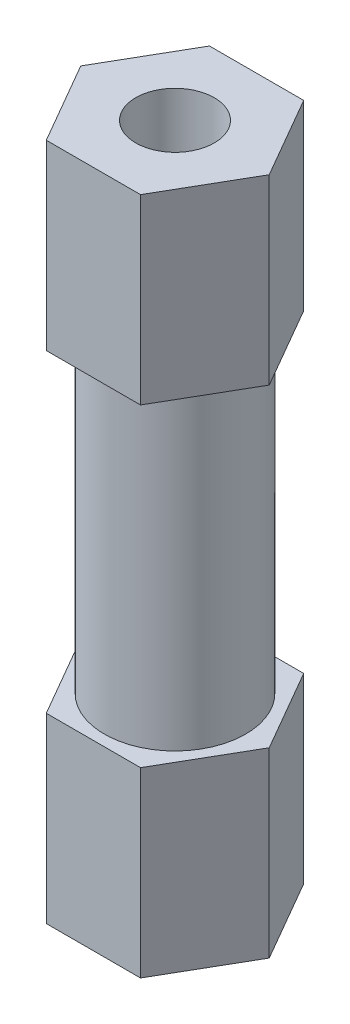
ISO-10303-21;
HEADER;
FILE_DESCRIPTION(('STEP AP214'),'2;1');
FILE_NAME('part.step','',(''),(''),'','','');
FILE_SCHEMA(('AUTOMOTIVE_DESIGN { 1 0 10303 214 1 1 1 1 }'));
ENDSEC;
DATA;
#1=APPLICATION_CONTEXT('core data for automotive mechanical design processes');
#2=APPLICATION_PROTOCOL_DEFINITION('international standard','automotive_design',2000,#1);
#3=PRODUCT_CONTEXT('',#1,'mechanical');
#4=PRODUCT('Part','Part','',(#3));
#5=PRODUCT_RELATED_PRODUCT_CATEGORY('part','',(#4));
#6=PRODUCT_DEFINITION_FORMATION('','',#4);
#7=PRODUCT_DEFINITION_CONTEXT('part definition',#1,'design');
#8=PRODUCT_DEFINITION('design','',#6,#7);
#9=PRODUCT_DEFINITION_SHAPE('','',#8);
#10=(LENGTH_UNIT() NAMED_UNIT(*) SI_UNIT(.MILLI.,.METRE.));
#11=(NAMED_UNIT(*) PLANE_ANGLE_UNIT() SI_UNIT($,.RADIAN.));
#12=(NAMED_UNIT(*) SI_UNIT($,.STERADIAN.) SOLID_ANGLE_UNIT());
#13=UNCERTAINTY_MEASURE_WITH_UNIT(LENGTH_MEASURE(1.E-05),#10,'distance_accuracy_value','');
#14=(GEOMETRIC_REPRESENTATION_CONTEXT(3) GLOBAL_UNCERTAINTY_ASSIGNED_CONTEXT((#13)) GLOBAL_UNIT_ASSIGNED_CONTEXT((#10,
#11,#12)) REPRESENTATION_CONTEXT('',''));
#15=CARTESIAN_POINT('',(0.,0.,0.));
#16=DIRECTION('',(0.,0.,1.));
#17=DIRECTION('',(1.,0.,0.));
#18=AXIS2_PLACEMENT_3D('',#15,#16,#17);
#19=CARTESIAN_POINT('',(0.,14.2,0.));
#20=DIRECTION('',(0.,-1.,0.));
#21=DIRECTION('',(0.,0.,-1.));
#22=AXIS2_PLACEMENT_3D('',#19,#20,#21);
#23=CYLINDRICAL_SURFACE('',#22,2.25);
#24=CARTESIAN_POINT('',(0.,4.2,0.));
#25=DIRECTION('',(0.,-1.,0.));
#26=DIRECTION('',(0.,0.,-1.));
#27=AXIS2_PLACEMENT_3D('',#24,#25,#26);
#28=CIRCLE('',#27,2.25);
#29=CARTESIAN_POINT('',(0.,4.2,-2.25));
#30=VERTEX_POINT('',#29);
#31=EDGE_CURVE('E126',#30,#30,#28,.F.);
#32=ORIENTED_EDGE('',*,*,#31,.T.);
#33=EDGE_LOOP('',(#32));
#34=FACE_BOUND('',#33,.T.);
#35=CARTESIAN_POINT('',(0.,14.2,0.));
#36=DIRECTION('',(0.,-1.,0.));
#37=DIRECTION('',(0.,0.,-1.));
#38=AXIS2_PLACEMENT_3D('',#35,#36,#37);
#39=CIRCLE('',#38,2.25);
#40=CARTESIAN_POINT('',(0.,14.2,-2.25));
#41=VERTEX_POINT('',#40);
#42=EDGE_CURVE('E20',#41,#41,#39,.F.);
#43=ORIENTED_EDGE('',*,*,#42,.F.);
#44=EDGE_LOOP('',(#43));
#45=FACE_BOUND('',#44,.T.);
#46=ADVANCED_FACE('F17',(#34,#45),#23,.T.);
#47=CARTESIAN_POINT('',(0.,14.2,0.));
#48=DIRECTION('',(0.,-1.,0.));
#49=DIRECTION('',(0.,0.,-1.));
#50=AXIS2_PLACEMENT_3D('',#47,#48,#49);
#51=PLANE('',#50);
#52=ORIENTED_EDGE('',*,*,#42,.T.);
#53=EDGE_LOOP('',(#52));
#54=FACE_BOUND('',#53,.T.);
#55=DIRECTION('',(0.500000000050997,0.,-0.866025403754996));
#56=VECTOR('',#55,1.);
#57=CARTESIAN_POINT('',(1.5,14.2,2.598076211));
#58=LINE('',#57,#56);
#59=CARTESIAN_POINT('',(1.49999999994262,14.2,2.59807621107729));
#60=VERTEX_POINT('',#59);
#61=CARTESIAN_POINT('',(2.99999999998088,14.2,-3.31225974548503E-11));
#62=VERTEX_POINT('',#61);
#63=EDGE_CURVE('E117',#60,#62,#58,.T.);
#64=ORIENTED_EDGE('',*,*,#63,.F.);
#65=DIRECTION('',(1.,0.,0.));
#66=VECTOR('',#65,1.);
#67=CARTESIAN_POINT('',(-1.5,14.2,2.598076211));
#68=LINE('',#67,#66);
#69=CARTESIAN_POINT('',(-1.4999999999235,14.2,2.59807621106625));
#70=VERTEX_POINT('',#69);
#71=EDGE_CURVE('E108',#70,#60,#68,.T.);
#72=ORIENTED_EDGE('',*,*,#71,.F.);
#73=DIRECTION('',(0.500000000050997,0.,0.866025403754996));
#74=VECTOR('',#73,1.);
#75=CARTESIAN_POINT('',(-3.,14.2,0.));
#76=LINE('',#75,#74);
#77=CARTESIAN_POINT('',(-2.99999999998088,14.2,3.31232520129126E-11));
#78=VERTEX_POINT('',#77);
#79=EDGE_CURVE('E103',#78,#70,#76,.T.);
#80=ORIENTED_EDGE('',*,*,#79,.F.);
#81=DIRECTION('',(-0.500000000050997,0.,0.866025403754996));
#82=VECTOR('',#81,1.);
#83=CARTESIAN_POINT('',(-1.5,14.2,-2.598076211));
#84=LINE('',#83,#82);
#85=CARTESIAN_POINT('',(-1.49999999986613,14.2,-2.59807621107729));
#86=VERTEX_POINT('',#85);
#87=EDGE_CURVE('E263',#86,#78,#84,.T.);
#88=ORIENTED_EDGE('',*,*,#87,.F.);
#89=DIRECTION('',(-1.,0.,0.));
#90=VECTOR('',#89,1.);
#91=CARTESIAN_POINT('',(1.5,14.2,-2.598076211));
#92=LINE('',#91,#90);
#93=CARTESIAN_POINT('',(1.49999999998005,14.2,-2.59807621103574));
#94=VERTEX_POINT('',#93);
#95=EDGE_CURVE('E259',#94,#86,#92,.T.);
#96=ORIENTED_EDGE('',*,*,#95,.F.);
#97=DIRECTION('',(-0.500000000050997,0.,-0.866025403754996));
#98=VECTOR('',#97,1.);
#99=CARTESIAN_POINT('',(3.,14.2,0.));
#100=LINE('',#99,#98);
#101=EDGE_CURVE('E122',#62,#94,#100,.T.);
#102=ORIENTED_EDGE('',*,*,#101,.F.);
#103=EDGE_LOOP('',(#64,#72,#80,#88,#96,#102));
#104=FACE_BOUND('',#103,.T.);
#105=ADVANCED_FACE('F120',(#54,#104),#51,.T.);
#106=CARTESIAN_POINT('',(0.,4.2,0.));
#107=DIRECTION('',(0.,-1.,0.));
#108=DIRECTION('',(0.,0.,-1.));
#109=AXIS2_PLACEMENT_3D('',#106,#107,#108);
#110=PLANE('',#109);
#111=ORIENTED_EDGE('',*,*,#31,.F.);
#112=EDGE_LOOP('',(#111));
#113=FACE_BOUND('',#112,.T.);
#114=DIRECTION('',(0.500000000050997,0.,-0.866025403754996));
#115=VECTOR('',#114,1.);
#116=CARTESIAN_POINT('',(1.5,4.19999999999999,2.598076211));
#117=LINE('',#116,#115);
#118=CARTESIAN_POINT('',(3.,4.19999999999999,0.));
#119=VERTEX_POINT('',#118);
#120=CARTESIAN_POINT('',(1.49999999996175,4.2,2.59807621106625));
#121=VERTEX_POINT('',#120);
#122=EDGE_CURVE('E219',#119,#121,#117,.F.);
#123=ORIENTED_EDGE('',*,*,#122,.F.);
#124=DIRECTION('',(-0.500000000050997,0.,-0.866025403754996));
#125=VECTOR('',#124,1.);
#126=CARTESIAN_POINT('',(3.,4.19999999999999,0.));
#127=LINE('',#126,#125);
#128=CARTESIAN_POINT('',(1.50000000014511,4.2,-2.59807621099157));
#129=VERTEX_POINT('',#128);
#130=EDGE_CURVE('E221',#129,#119,#127,.F.);
#131=ORIENTED_EDGE('',*,*,#130,.F.);
#132=DIRECTION('',(-1.,0.,0.));
#133=VECTOR('',#132,1.);
#134=CARTESIAN_POINT('',(1.5,4.2,-2.598076211));
#135=LINE('',#134,#133);
#136=CARTESIAN_POINT('',(-1.4999999998757,4.2,-2.59807621101656));
#137=VERTEX_POINT('',#136);
#138=EDGE_CURVE('E239',#137,#129,#135,.F.);
#139=ORIENTED_EDGE('',*,*,#138,.F.);
#140=DIRECTION('',(-0.500000000050997,0.,0.866025403754996));
#141=VECTOR('',#140,1.);
#142=CARTESIAN_POINT('',(-1.5,4.19999999999999,-2.598076211));
#143=LINE('',#142,#141);
#144=CARTESIAN_POINT('',(-2.99999999999044,4.19999999999999,-1.6560887317506E-11));
#145=VERTEX_POINT('',#144);
#146=EDGE_CURVE('E244',#145,#137,#143,.F.);
#147=ORIENTED_EDGE('',*,*,#146,.F.);
#148=DIRECTION('',(0.500000000050997,0.,0.866025403754996));
#149=VECTOR('',#148,1.);
#150=CARTESIAN_POINT('',(-3.,4.19999999999999,0.));
#151=LINE('',#150,#149);
#152=CARTESIAN_POINT('',(-1.49999999995219,4.2,2.59807621106073));
#153=VERTEX_POINT('',#152);
#154=EDGE_CURVE('E249',#153,#145,#151,.F.);
#155=ORIENTED_EDGE('',*,*,#154,.F.);
#156=DIRECTION('',(1.,0.,0.));
#157=VECTOR('',#156,1.);
#158=CARTESIAN_POINT('',(-1.5,4.2,2.598076211));
#159=LINE('',#158,#157);
#160=EDGE_CURVE('E223',#121,#153,#159,.F.);
#161=ORIENTED_EDGE('',*,*,#160,.F.);
#162=EDGE_LOOP('',(#123,#131,#139,#147,#155,#161));
#163=FACE_BOUND('',#162,.T.);
#164=ADVANCED_FACE('F149',(#113,#163),#110,.F.);
#165=CARTESIAN_POINT('',(1.5,10.110836135,2.598076211));
#166=DIRECTION('',(0.866025403754996,0.,0.500000000050997));
#167=DIRECTION('',(0.500000000050997,0.,-0.866025403754996));
#168=AXIS2_PLACEMENT_3D('',#165,#166,#167);
#169=PLANE('',#168);
#170=DIRECTION('',(0.,1.,0.));
#171=VECTOR('',#170,1.);
#172=CARTESIAN_POINT('',(2.99999999992351,10.110836135,-1.32489967643764E-10));
#173=LINE('',#172,#171);
#174=CARTESIAN_POINT('',(2.99999999990438,20.,-3.31230515849597E-11));
#175=VERTEX_POINT('',#174);
#176=EDGE_CURVE('E255',#175,#62,#173,.F.);
#177=ORIENTED_EDGE('',*,*,#176,.F.);
#178=DIRECTION('',(-0.5,0.,0.866025403784439));
#179=VECTOR('',#178,1.);
#180=CARTESIAN_POINT('',(2.99999999969403,20.,0.));
#181=LINE('',#180,#179);
#182=CARTESIAN_POINT('',(1.49999999991075,20.,2.59807621108833));
#183=VERTEX_POINT('',#182);
#184=EDGE_CURVE('E130',#175,#183,#181,.T.);
#185=ORIENTED_EDGE('',*,*,#184,.T.);
#186=DIRECTION('',(0.,1.,0.));
#187=VECTOR('',#186,1.);
#188=CARTESIAN_POINT('',(1.499999999949,10.110836135,2.598076211));
#189=LINE('',#188,#187);
#190=EDGE_CURVE('E113',#60,#183,#189,.T.);
#191=ORIENTED_EDGE('',*,*,#190,.F.);
#192=ORIENTED_EDGE('',*,*,#63,.T.);
#193=EDGE_LOOP('',(#177,#185,#191,#192));
#194=FACE_BOUND('',#193,.T.);
#195=ADVANCED_FACE('F129',(#194),#169,.T.);
#196=CARTESIAN_POINT('',(-1.5,10.110836135,2.598076211));
#197=DIRECTION('',(0.,0.,1.));
#198=DIRECTION('',(1.,0.,0.));
#199=AXIS2_PLACEMENT_3D('',#196,#197,#198);
#200=PLANE('',#199);
#201=ORIENTED_EDGE('',*,*,#190,.T.);
#202=DIRECTION('',(1.,0.,0.));
#203=VECTOR('',#202,1.);
#204=CARTESIAN_POINT('',(0.,20.,2.59807621108834));
#205=LINE('',#204,#203);
#206=CARTESIAN_POINT('',(-1.49999999987251,20.,2.59807621104417));
#207=VERTEX_POINT('',#206);
#208=EDGE_CURVE('E270',#183,#207,#205,.F.);
#209=ORIENTED_EDGE('',*,*,#208,.T.);
#210=DIRECTION('',(0.,1.,0.));
#211=VECTOR('',#210,1.);
#212=CARTESIAN_POINT('',(-1.499999999949,10.110836135,2.59807621108834));
#213=LINE('',#212,#211);
#214=EDGE_CURVE('E115',#70,#207,#213,.T.);
#215=ORIENTED_EDGE('',*,*,#214,.F.);
#216=ORIENTED_EDGE('',*,*,#71,.T.);
#217=EDGE_LOOP('',(#201,#209,#215,#216));
#218=FACE_BOUND('',#217,.T.);
#219=ADVANCED_FACE('F110',(#218),#200,.T.);
#220=CARTESIAN_POINT('',(-3.,10.110836135,0.));
#221=DIRECTION('',(-0.866025403754996,0.,0.500000000050997));
#222=DIRECTION('',(0.500000000050997,0.,0.866025403754996));
#223=AXIS2_PLACEMENT_3D('',#220,#221,#222);
#224=PLANE('',#223);
#225=ORIENTED_EDGE('',*,*,#214,.T.);
#226=DIRECTION('',(-0.5,0.,-0.866025403784439));
#227=VECTOR('',#226,1.);
#228=CARTESIAN_POINT('',(-1.49999999984701,20.,2.59807621108834));
#229=LINE('',#228,#227);
#230=CARTESIAN_POINT('',(-2.99999999988526,20.,6.62455814809509E-11));
#231=VERTEX_POINT('',#230);
#232=EDGE_CURVE('E266',#207,#231,#229,.T.);
#233=ORIENTED_EDGE('',*,*,#232,.T.);
#234=DIRECTION('',(0.,1.,0.));
#235=VECTOR('',#234,1.);
#236=CARTESIAN_POINT('',(-3.,10.110836135,0.));
#237=LINE('',#236,#235);
#238=EDGE_CURVE('E261',#78,#231,#237,.T.);
#239=ORIENTED_EDGE('',*,*,#238,.F.);
#240=ORIENTED_EDGE('',*,*,#79,.T.);
#241=EDGE_LOOP('',(#225,#233,#239,#240));
#242=FACE_BOUND('',#241,.T.);
#243=ADVANCED_FACE('F203',(#242),#224,.T.);
#244=CARTESIAN_POINT('',(-1.5,10.110836135,-2.598076211));
#245=DIRECTION('',(-0.866025403754996,0.,-0.500000000050997));
#246=DIRECTION('',(-0.500000000050997,0.,0.866025403754996));
#247=AXIS2_PLACEMENT_3D('',#244,#245,#246);
#248=PLANE('',#247);
#249=ORIENTED_EDGE('',*,*,#238,.T.);
#250=DIRECTION('',(0.5,0.,-0.866025403784439));
#251=VECTOR('',#250,1.);
#252=CARTESIAN_POINT('',(-2.99999999969403,20.,0.));
#253=LINE('',#252,#251);
#254=CARTESIAN_POINT('',(-1.49999999988526,20.,-2.59807621108833));
#255=VERTEX_POINT('',#254);
#256=EDGE_CURVE('E272',#231,#255,#253,.T.);
#257=ORIENTED_EDGE('',*,*,#256,.T.);
#258=DIRECTION('',(0.,1.,0.));
#259=VECTOR('',#258,1.);
#260=CARTESIAN_POINT('',(-1.49999999984701,10.110836135,-2.598076211));
#261=LINE('',#260,#259);
#262=EDGE_CURVE('E257',#86,#255,#261,.T.);
#263=ORIENTED_EDGE('',*,*,#262,.F.);
#264=ORIENTED_EDGE('',*,*,#87,.T.);
#265=EDGE_LOOP('',(#249,#257,#263,#264));
#266=FACE_BOUND('',#265,.T.);
#267=ADVANCED_FACE('F199',(#266),#248,.T.);
#268=CARTESIAN_POINT('',(1.5,10.110836135,-2.598076211));
#269=DIRECTION('',(0.,0.,-1.));
#270=DIRECTION('',(-1.,0.,0.));
#271=AXIS2_PLACEMENT_3D('',#268,#269,#270);
#272=PLANE('',#271);
#273=ORIENTED_EDGE('',*,*,#262,.T.);
#274=DIRECTION('',(1.,0.,0.));
#275=VECTOR('',#274,1.);
#276=CARTESIAN_POINT('',(0.,20.,-2.59807621108834));
#277=LINE('',#276,#275);
#278=CARTESIAN_POINT('',(1.49999999989013,20.,-2.59807621101366));
#279=VERTEX_POINT('',#278);
#280=EDGE_CURVE('E301',#255,#279,#277,.T.);
#281=ORIENTED_EDGE('',*,*,#280,.T.);
#282=DIRECTION('',(0.,1.,0.));
#283=VECTOR('',#282,1.);
#284=CARTESIAN_POINT('',(1.50000000001947,10.110836135,-2.59807621096628));
#285=LINE('',#284,#283);
#286=EDGE_CURVE('E252',#94,#279,#285,.T.);
#287=ORIENTED_EDGE('',*,*,#286,.F.);
#288=ORIENTED_EDGE('',*,*,#95,.T.);
#289=EDGE_LOOP('',(#273,#281,#287,#288));
#290=FACE_BOUND('',#289,.T.);
#291=ADVANCED_FACE('F195',(#290),#272,.T.);
#292=CARTESIAN_POINT('',(3.,10.110836135,0.));
#293=DIRECTION('',(0.866025403754996,0.,-0.500000000050997));
#294=DIRECTION('',(-0.500000000050997,0.,-0.866025403754996));
#295=AXIS2_PLACEMENT_3D('',#292,#293,#294);
#296=PLANE('',#295);
#297=ORIENTED_EDGE('',*,*,#286,.T.);
#298=DIRECTION('',(0.5,0.,0.866025403784439));
#299=VECTOR('',#298,1.);
#300=CARTESIAN_POINT('',(1.49999999984701,20.,-2.59807621108834));
#301=LINE('',#300,#299);
#302=EDGE_CURVE('E298',#279,#175,#301,.T.);
#303=ORIENTED_EDGE('',*,*,#302,.T.);
#304=ORIENTED_EDGE('',*,*,#176,.T.);
#305=ORIENTED_EDGE('',*,*,#101,.T.);
#306=EDGE_LOOP('',(#297,#303,#304,#305));
#307=FACE_BOUND('',#306,.T.);
#308=ADVANCED_FACE('F191',(#307),#296,.T.);
#309=CARTESIAN_POINT('',(-1.5,10.110836135,2.598076211));
#310=DIRECTION('',(0.,0.,1.));
#311=DIRECTION('',(1.,0.,0.));
#312=AXIS2_PLACEMENT_3D('',#309,#310,#311);
#313=PLANE('',#312);
#314=DIRECTION('',(1.,0.,0.));
#315=VECTOR('',#314,1.);
#316=CARTESIAN_POINT('',(0.,-1.6,2.598076211));
#317=LINE('',#316,#315);
#318=CARTESIAN_POINT('',(1.49999999998725,-1.6,2.59807621102208));
#319=VERTEX_POINT('',#318);
#320=CARTESIAN_POINT('',(-1.49999999996494,-1.60000000000001,2.59807621101656));
#321=VERTEX_POINT('',#320);
#322=EDGE_CURVE('E290',#319,#321,#317,.F.);
#323=ORIENTED_EDGE('',*,*,#322,.F.);
#324=DIRECTION('',(0.,1.,0.));
#325=VECTOR('',#324,1.);
#326=CARTESIAN_POINT('',(1.499999999949,10.110836135,2.59807621108834));
#327=LINE('',#326,#325);
#328=EDGE_CURVE('E226',#121,#319,#327,.F.);
#329=ORIENTED_EDGE('',*,*,#328,.F.);
#330=ORIENTED_EDGE('',*,*,#160,.T.);
#331=DIRECTION('',(0.,1.,0.));
#332=VECTOR('',#331,1.);
#333=CARTESIAN_POINT('',(-1.49999999996175,10.110836135,2.59807621106625));
#334=LINE('',#333,#332);
#335=EDGE_CURVE('E246',#321,#153,#334,.T.);
#336=ORIENTED_EDGE('',*,*,#335,.F.);
#337=EDGE_LOOP('',(#323,#329,#330,#336));
#338=FACE_BOUND('',#337,.T.);
#339=ADVANCED_FACE('F187',(#338),#313,.T.);
#340=CARTESIAN_POINT('',(-3.,10.110836135,0.));
#341=DIRECTION('',(-0.866025403754996,0.,0.500000000050997));
#342=DIRECTION('',(0.500000000050997,0.,0.866025403754996));
#343=AXIS2_PLACEMENT_3D('',#340,#341,#342);
#344=PLANE('',#343);
#345=DIRECTION('',(-0.500000000031873,0.,-0.866025403766037));
#346=VECTOR('',#345,1.);
#347=CARTESIAN_POINT('',(-1.49999999996175,-1.6,2.59807621106625));
#348=LINE('',#347,#346);
#349=CARTESIAN_POINT('',(-2.99999999998088,-1.60000000000001,-3.31229854143452E-11));
#350=VERTEX_POINT('',#349);
#351=EDGE_CURVE('E287',#321,#350,#348,.T.);
#352=ORIENTED_EDGE('',*,*,#351,.F.);
#353=ORIENTED_EDGE('',*,*,#335,.T.);
#354=ORIENTED_EDGE('',*,*,#154,.T.);
#355=DIRECTION('',(0.,1.,0.));
#356=VECTOR('',#355,1.);
#357=CARTESIAN_POINT('',(-2.99999999996175,10.110836135,-6.62451864197333E-11));
#358=LINE('',#357,#356);
#359=EDGE_CURVE('E241',#350,#145,#358,.T.);
#360=ORIENTED_EDGE('',*,*,#359,.F.);
#361=EDGE_LOOP('',(#352,#353,#354,#360));
#362=FACE_BOUND('',#361,.T.);
#363=ADVANCED_FACE('F183',(#362),#344,.T.);
#364=CARTESIAN_POINT('',(-1.5,10.110836135,-2.598076211));
#365=DIRECTION('',(-0.866025403754996,0.,-0.500000000050997));
#366=DIRECTION('',(-0.500000000050997,0.,0.866025403754996));
#367=AXIS2_PLACEMENT_3D('',#364,#365,#366);
#368=PLANE('',#367);
#369=DIRECTION('',(0.500000000076495,0.,-0.866025403740274));
#370=VECTOR('',#369,1.);
#371=CARTESIAN_POINT('',(-2.99999999996175,-1.6,-6.62456201006023E-11));
#372=LINE('',#371,#370);
#373=CARTESIAN_POINT('',(-1.49999999990438,-1.6,-2.59807621105521));
#374=VERTEX_POINT('',#373);
#375=EDGE_CURVE('E285',#350,#374,#372,.T.);
#376=ORIENTED_EDGE('',*,*,#375,.F.);
#377=ORIENTED_EDGE('',*,*,#359,.T.);
#378=ORIENTED_EDGE('',*,*,#146,.T.);
#379=DIRECTION('',(0.,1.,0.));
#380=VECTOR('',#379,1.);
#381=CARTESIAN_POINT('',(-1.49999999984701,10.110836135,-2.598076211));
#382=LINE('',#381,#380);
#383=EDGE_CURVE('E236',#374,#137,#382,.T.);
#384=ORIENTED_EDGE('',*,*,#383,.F.);
#385=EDGE_LOOP('',(#376,#377,#378,#384));
#386=FACE_BOUND('',#385,.T.);
#387=ADVANCED_FACE('F179',(#386),#368,.T.);
#388=CARTESIAN_POINT('',(1.5,10.110836135,-2.598076211));
#389=DIRECTION('',(0.,0.,-1.));
#390=DIRECTION('',(-1.,0.,0.));
#391=AXIS2_PLACEMENT_3D('',#388,#389,#390);
#392=PLANE('',#391);
#393=DIRECTION('',(1.,0.,0.));
#394=VECTOR('',#393,1.);
#395=CARTESIAN_POINT('',(0.,-1.6,-2.59807621108833));
#396=LINE('',#395,#394);
#397=CARTESIAN_POINT('',(1.50000000008808,-1.60000000000001,-2.59807621101365));
#398=VERTEX_POINT('',#397);
#399=EDGE_CURVE('E280',#374,#398,#396,.T.);
#400=ORIENTED_EDGE('',*,*,#399,.F.);
#401=ORIENTED_EDGE('',*,*,#383,.T.);
#402=ORIENTED_EDGE('',*,*,#138,.T.);
#403=DIRECTION('',(0.,1.,0.));
#404=VECTOR('',#403,1.);
#405=CARTESIAN_POINT('',(1.50000000001947,10.110836135,-2.59807621096628));
#406=LINE('',#405,#404);
#407=EDGE_CURVE('E227',#398,#129,#406,.T.);
#408=ORIENTED_EDGE('',*,*,#407,.F.);
#409=EDGE_LOOP('',(#400,#401,#402,#408));
#410=FACE_BOUND('',#409,.T.);
#411=ADVANCED_FACE('F175',(#410),#392,.T.);
#412=CARTESIAN_POINT('',(3.,10.110836135,0.));
#413=DIRECTION('',(0.866025403754996,0.,-0.500000000050997));
#414=DIRECTION('',(-0.500000000050997,0.,-0.866025403754996));
#415=AXIS2_PLACEMENT_3D('',#412,#413,#414);
#416=PLANE('',#415);
#417=DIRECTION('',(0.500000000031531,0.,0.866025403766235));
#418=VECTOR('',#417,1.);
#419=CARTESIAN_POINT('',(1.50000000007786,-1.6,-2.598076211));
#420=LINE('',#419,#418);
#421=CARTESIAN_POINT('',(3.,-1.60000000000001,0.));
#422=VERTEX_POINT('',#421);
#423=EDGE_CURVE('E35',#398,#422,#420,.T.);
#424=ORIENTED_EDGE('',*,*,#423,.F.);
#425=ORIENTED_EDGE('',*,*,#407,.T.);
#426=ORIENTED_EDGE('',*,*,#130,.T.);
#427=DIRECTION('',(0.,1.,0.));
#428=VECTOR('',#427,1.);
#429=CARTESIAN_POINT('',(3.,10.110836135,0.));
#430=LINE('',#429,#428);
#431=EDGE_CURVE('E229',#422,#119,#430,.T.);
#432=ORIENTED_EDGE('',*,*,#431,.F.);
#433=EDGE_LOOP('',(#424,#425,#426,#432));
#434=FACE_BOUND('',#433,.T.);
#435=ADVANCED_FACE('F171',(#434),#416,.T.);
#436=CARTESIAN_POINT('',(1.5,10.110836135,2.598076211));
#437=DIRECTION('',(0.866025403754996,0.,0.500000000050997));
#438=DIRECTION('',(0.500000000050997,0.,-0.866025403754996));
#439=AXIS2_PLACEMENT_3D('',#436,#437,#438);
#440=PLANE('',#439);
#441=DIRECTION('',(-0.500000000050997,0.,0.866025403754996));
#442=VECTOR('',#441,1.);
#443=CARTESIAN_POINT('',(3.,-1.6,0.));
#444=LINE('',#443,#442);
#445=EDGE_CURVE('E136',#422,#319,#444,.T.);
#446=ORIENTED_EDGE('',*,*,#445,.F.);
#447=ORIENTED_EDGE('',*,*,#431,.T.);
#448=ORIENTED_EDGE('',*,*,#122,.T.);
#449=ORIENTED_EDGE('',*,*,#328,.T.);
#450=EDGE_LOOP('',(#446,#447,#448,#449));
#451=FACE_BOUND('',#450,.T.);
#452=ADVANCED_FACE('F167',(#451),#440,.T.);
#453=CARTESIAN_POINT('',(0.,20.,0.));
#454=DIRECTION('',(0.,-1.,0.));
#455=DIRECTION('',(0.,0.,-1.));
#456=AXIS2_PLACEMENT_3D('',#453,#454,#455);
#457=PLANE('',#456);
#458=ORIENTED_EDGE('',*,*,#280,.F.);
#459=ORIENTED_EDGE('',*,*,#256,.F.);
#460=ORIENTED_EDGE('',*,*,#232,.F.);
#461=ORIENTED_EDGE('',*,*,#208,.F.);
#462=ORIENTED_EDGE('',*,*,#184,.F.);
#463=ORIENTED_EDGE('',*,*,#302,.F.);
#464=EDGE_LOOP('',(#458,#459,#460,#461,#462,#463));
#465=FACE_BOUND('',#464,.T.);
#466=CARTESIAN_POINT('',(0.,20.,0.));
#467=DIRECTION('',(0.,1.,0.));
#468=DIRECTION('',(0.,0.,1.));
#469=AXIS2_PLACEMENT_3D('',#466,#467,#468);
#470=CIRCLE('',#469,1.24999999999999);
#471=CARTESIAN_POINT('',(0.,20.,1.24999999999999));
#472=VERTEX_POINT('',#471);
#473=EDGE_CURVE('E26',#472,#472,#470,.F.);
#474=ORIENTED_EDGE('',*,*,#473,.T.);
#475=EDGE_LOOP('',(#474));
#476=FACE_BOUND('',#475,.T.);
#477=ADVANCED_FACE('F159',(#465,#476),#457,.F.);
#478=CARTESIAN_POINT('',(0.,-1.6,0.));
#479=DIRECTION('',(0.,-1.,0.));
#480=DIRECTION('',(0.,0.,-1.));
#481=AXIS2_PLACEMENT_3D('',#478,#479,#480);
#482=PLANE('',#481);
#483=CARTESIAN_POINT('',(0.,-1.6,0.));
#484=DIRECTION('',(0.,1.,0.));
#485=DIRECTION('',(0.,0.,1.));
#486=AXIS2_PLACEMENT_3D('',#483,#484,#485);
#487=CIRCLE('',#486,1.24999999999999);
#488=CARTESIAN_POINT('',(0.,-1.6,1.24999999999999));
#489=VERTEX_POINT('',#488);
#490=EDGE_CURVE('E11',#489,#489,#487,.T.);
#491=ORIENTED_EDGE('',*,*,#490,.T.);
#492=EDGE_LOOP('',(#491));
#493=FACE_BOUND('',#492,.T.);
#494=ORIENTED_EDGE('',*,*,#423,.T.);
#495=ORIENTED_EDGE('',*,*,#445,.T.);
#496=ORIENTED_EDGE('',*,*,#322,.T.);
#497=ORIENTED_EDGE('',*,*,#351,.T.);
#498=ORIENTED_EDGE('',*,*,#375,.T.);
#499=ORIENTED_EDGE('',*,*,#399,.T.);
#500=EDGE_LOOP('',(#494,#495,#496,#497,#498,#499));
#501=FACE_BOUND('',#500,.T.);
#502=ADVANCED_FACE('F152',(#493,#501),#482,.T.);
#503=CARTESIAN_POINT('',(0.,20.,0.));
#504=DIRECTION('',(0.,1.,0.));
#505=DIRECTION('',(0.,0.,1.));
#506=AXIS2_PLACEMENT_3D('',#503,#504,#505);
#507=CYLINDRICAL_SURFACE('',#506,1.24999999999999);
#508=ORIENTED_EDGE('',*,*,#473,.F.);
#509=EDGE_LOOP('',(#508));
#510=FACE_BOUND('',#509,.T.);
#511=ORIENTED_EDGE('',*,*,#490,.F.);
#512=EDGE_LOOP('',(#511));
#513=FACE_BOUND('',#512,.T.);
#514=ADVANCED_FACE('F150',(#510,#513),#507,.F.);
#515=CLOSED_SHELL('',(#46,#105,#164,#195,#219,#243,#267,#291,#308,#339,#363,#387,#411,#435,#452,
#477,#502,#514));
#516=MANIFOLD_SOLID_BREP('B1',#515);
#517=ADVANCED_BREP_SHAPE_REPRESENTATION('',(#18,#516),#14);
#518=SHAPE_DEFINITION_REPRESENTATION(#9,#517);
ENDSEC;
END-ISO-10303-21;
